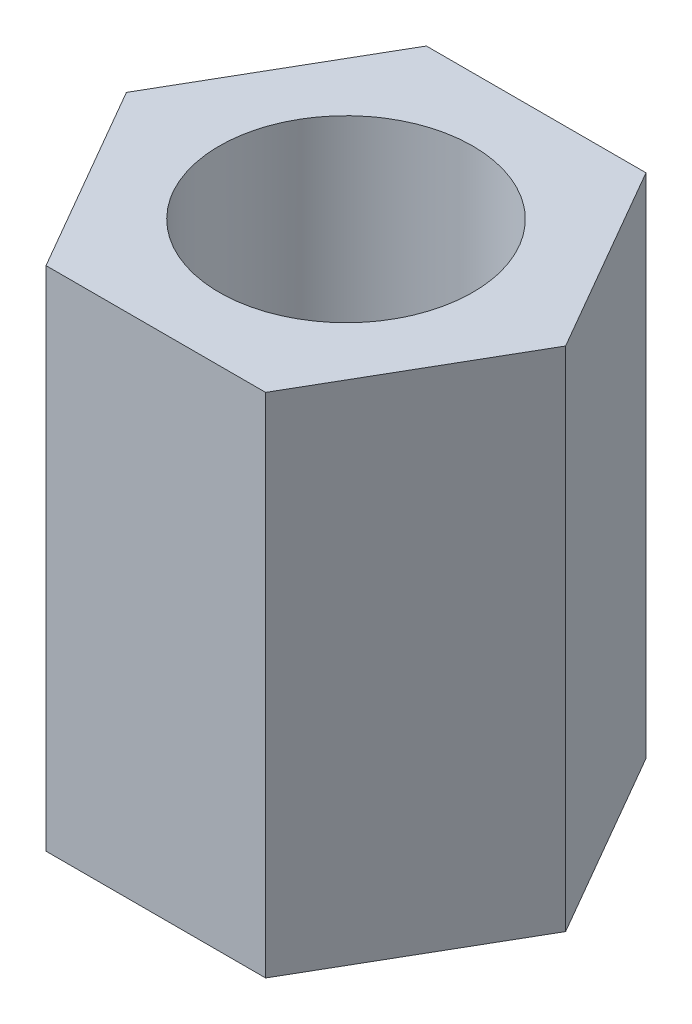
ISO-10303-21;
HEADER;
FILE_DESCRIPTION(('STEP AP214'),'2;1');
FILE_NAME('part.step','',(''),(''),'','','');
FILE_SCHEMA(('AUTOMOTIVE_DESIGN { 1 0 10303 214 1 1 1 1 }'));
ENDSEC;
DATA;
#1=APPLICATION_CONTEXT('core data for automotive mechanical design processes');
#2=APPLICATION_PROTOCOL_DEFINITION('international standard','automotive_design',2000,#1);
#3=PRODUCT_CONTEXT('',#1,'mechanical');
#4=PRODUCT('Part','Part','',(#3));
#5=PRODUCT_RELATED_PRODUCT_CATEGORY('part','',(#4));
#6=PRODUCT_DEFINITION_FORMATION('','',#4);
#7=PRODUCT_DEFINITION_CONTEXT('part definition',#1,'design');
#8=PRODUCT_DEFINITION('design','',#6,#7);
#9=PRODUCT_DEFINITION_SHAPE('','',#8);
#10=(LENGTH_UNIT() NAMED_UNIT(*) SI_UNIT(.MILLI.,.METRE.));
#11=(NAMED_UNIT(*) PLANE_ANGLE_UNIT() SI_UNIT($,.RADIAN.));
#12=(NAMED_UNIT(*) SI_UNIT($,.STERADIAN.) SOLID_ANGLE_UNIT());
#13=UNCERTAINTY_MEASURE_WITH_UNIT(LENGTH_MEASURE(1.E-05),#10,'distance_accuracy_value','');
#14=(GEOMETRIC_REPRESENTATION_CONTEXT(3) GLOBAL_UNCERTAINTY_ASSIGNED_CONTEXT((#13)) GLOBAL_UNIT_ASSIGNED_CONTEXT((#10,
#11,#12)) REPRESENTATION_CONTEXT('',''));
#15=CARTESIAN_POINT('',(0.,0.,0.));
#16=DIRECTION('',(0.,0.,1.));
#17=DIRECTION('',(1.,0.,0.));
#18=AXIS2_PLACEMENT_3D('',#15,#16,#17);
#19=CARTESIAN_POINT('',(1.732050808,0.,-3.));
#20=DIRECTION('',(-0.866025403855548,0.,0.499999999876834));
#21=DIRECTION('',(0.499999999876834,0.,0.866025403855548));
#22=AXIS2_PLACEMENT_3D('',#19,#20,#21);
#23=PLANE('',#22);
#24=DIRECTION('',(0.,1.,0.));
#25=VECTOR('',#24,1.);
#26=CARTESIAN_POINT('',(1.732050808,0.,-3.));
#27=LINE('',#26,#25);
#28=CARTESIAN_POINT('',(1.732050808,0.,-3.));
#29=VERTEX_POINT('',#28);
#30=CARTESIAN_POINT('',(1.732050808,8.,-3.));
#31=VERTEX_POINT('',#30);
#32=EDGE_CURVE('E22',#29,#31,#27,.T.);
#33=ORIENTED_EDGE('',*,*,#32,.T.);
#34=DIRECTION('',(-0.499999999876834,0.,-0.866025403855548));
#35=VECTOR('',#34,1.);
#36=CARTESIAN_POINT('',(3.46410161472361,8.,-4.78716025154036E-10));
#37=LINE('',#36,#35);
#38=CARTESIAN_POINT('',(3.464101615,8.,0.));
#39=VERTEX_POINT('',#38);
#40=EDGE_CURVE('E88',#39,#31,#37,.T.);
#41=ORIENTED_EDGE('',*,*,#40,.F.);
#42=DIRECTION('',(0.,1.,0.));
#43=VECTOR('',#42,1.);
#44=CARTESIAN_POINT('',(3.464101615,0.,0.));
#45=LINE('',#44,#43);
#46=CARTESIAN_POINT('',(3.464101615,0.,0.));
#47=VERTEX_POINT('',#46);
#48=EDGE_CURVE('E86',#39,#47,#45,.F.);
#49=ORIENTED_EDGE('',*,*,#48,.T.);
#50=DIRECTION('',(0.499999999876834,0.,0.866025403855548));
#51=VECTOR('',#50,1.);
#52=CARTESIAN_POINT('',(1.732050808,0.,-3.));
#53=LINE('',#52,#51);
#54=EDGE_CURVE('E73',#47,#29,#53,.F.);
#55=ORIENTED_EDGE('',*,*,#54,.T.);
#56=EDGE_LOOP('',(#33,#41,#49,#55));
#57=FACE_BOUND('',#56,.T.);
#58=ADVANCED_FACE('F17',(#57),#23,.F.);
#59=CARTESIAN_POINT('',(-1.732050808,0.,-3.));
#60=DIRECTION('',(0.,0.,1.));
#61=DIRECTION('',(1.,0.,0.));
#62=AXIS2_PLACEMENT_3D('',#59,#60,#61);
#63=PLANE('',#62);
#64=DIRECTION('',(0.,1.,0.));
#65=VECTOR('',#64,1.);
#66=CARTESIAN_POINT('',(-1.732050808,0.,-3.));
#67=LINE('',#66,#65);
#68=CARTESIAN_POINT('',(-1.732050808,0.,-3.));
#69=VERTEX_POINT('',#68);
#70=CARTESIAN_POINT('',(-1.732050808,8.,-3.));
#71=VERTEX_POINT('',#70);
#72=EDGE_CURVE('E145',#69,#71,#67,.T.);
#73=ORIENTED_EDGE('',*,*,#72,.T.);
#74=DIRECTION('',(1.,0.,0.));
#75=VECTOR('',#74,1.);
#76=CARTESIAN_POINT('',(-3.505670835,8.,-3.));
#77=LINE('',#76,#75);
#78=EDGE_CURVE('E129',#31,#71,#77,.F.);
#79=ORIENTED_EDGE('',*,*,#78,.F.);
#80=ORIENTED_EDGE('',*,*,#32,.F.);
#81=DIRECTION('',(1.,0.,0.));
#82=VECTOR('',#81,1.);
#83=CARTESIAN_POINT('',(-1.732050808,0.,-3.));
#84=LINE('',#83,#82);
#85=EDGE_CURVE('E79',#29,#69,#84,.F.);
#86=ORIENTED_EDGE('',*,*,#85,.T.);
#87=EDGE_LOOP('',(#73,#79,#80,#86));
#88=FACE_BOUND('',#87,.T.);
#89=ADVANCED_FACE('F155',(#88),#63,.F.);
#90=CARTESIAN_POINT('',(-3.464101615,0.,0.));
#91=DIRECTION('',(0.866025403855548,0.,0.499999999876834));
#92=DIRECTION('',(0.499999999876834,0.,-0.866025403855548));
#93=AXIS2_PLACEMENT_3D('',#90,#91,#92);
#94=PLANE('',#93);
#95=DIRECTION('',(0.,1.,0.));
#96=VECTOR('',#95,1.);
#97=CARTESIAN_POINT('',(-3.464101615,0.,0.));
#98=LINE('',#97,#96);
#99=CARTESIAN_POINT('',(-3.464101615,0.,0.));
#100=VERTEX_POINT('',#99);
#101=CARTESIAN_POINT('',(-3.464101615,8.,0.));
#102=VERTEX_POINT('',#101);
#103=EDGE_CURVE('E142',#100,#102,#98,.T.);
#104=ORIENTED_EDGE('',*,*,#103,.T.);
#105=DIRECTION('',(-0.499999999876834,0.,0.866025403855548));
#106=VECTOR('',#105,1.);
#107=CARTESIAN_POINT('',(-1.73205080773681,8.,-3.00000000045586));
#108=LINE('',#107,#106);
#109=EDGE_CURVE('E126',#71,#102,#108,.T.);
#110=ORIENTED_EDGE('',*,*,#109,.F.);
#111=ORIENTED_EDGE('',*,*,#72,.F.);
#112=DIRECTION('',(0.499999999876834,0.,-0.866025403855548));
#113=VECTOR('',#112,1.);
#114=CARTESIAN_POINT('',(-3.464101615,0.,0.));
#115=LINE('',#114,#113);
#116=EDGE_CURVE('E114',#69,#100,#115,.F.);
#117=ORIENTED_EDGE('',*,*,#116,.T.);
#118=EDGE_LOOP('',(#104,#110,#111,#117));
#119=FACE_BOUND('',#118,.T.);
#120=ADVANCED_FACE('F166',(#119),#94,.F.);
#121=CARTESIAN_POINT('',(-1.732050808,0.,3.));
#122=DIRECTION('',(0.866025403855548,0.,-0.499999999876834));
#123=DIRECTION('',(-0.499999999876834,0.,-0.866025403855548));
#124=AXIS2_PLACEMENT_3D('',#121,#122,#123);
#125=PLANE('',#124);
#126=DIRECTION('',(0.,1.,0.));
#127=VECTOR('',#126,1.);
#128=CARTESIAN_POINT('',(-1.732050808,0.,3.));
#129=LINE('',#128,#127);
#130=CARTESIAN_POINT('',(-1.732050808,0.,3.));
#131=VERTEX_POINT('',#130);
#132=CARTESIAN_POINT('',(-1.732050808,8.,3.));
#133=VERTEX_POINT('',#132);
#134=EDGE_CURVE('E138',#131,#133,#129,.T.);
#135=ORIENTED_EDGE('',*,*,#134,.T.);
#136=DIRECTION('',(0.499999999876834,0.,0.866025403855548));
#137=VECTOR('',#136,1.);
#138=CARTESIAN_POINT('',(-3.46410161472361,8.,4.78716025154036E-10));
#139=LINE('',#138,#137);
#140=EDGE_CURVE('E123',#102,#133,#139,.T.);
#141=ORIENTED_EDGE('',*,*,#140,.F.);
#142=ORIENTED_EDGE('',*,*,#103,.F.);
#143=DIRECTION('',(-0.499999999876834,0.,-0.866025403855548));
#144=VECTOR('',#143,1.);
#145=CARTESIAN_POINT('',(-1.732050808,0.,3.));
#146=LINE('',#145,#144);
#147=EDGE_CURVE('E104',#100,#131,#146,.F.);
#148=ORIENTED_EDGE('',*,*,#147,.T.);
#149=EDGE_LOOP('',(#135,#141,#142,#148));
#150=FACE_BOUND('',#149,.T.);
#151=ADVANCED_FACE('F164',(#150),#125,.F.);
#152=CARTESIAN_POINT('',(1.732050808,0.,3.));
#153=DIRECTION('',(0.,0.,-1.));
#154=DIRECTION('',(-1.,0.,0.));
#155=AXIS2_PLACEMENT_3D('',#152,#153,#154);
#156=PLANE('',#155);
#157=DIRECTION('',(0.,1.,0.));
#158=VECTOR('',#157,1.);
#159=CARTESIAN_POINT('',(1.732050808,0.,3.));
#160=LINE('',#159,#158);
#161=CARTESIAN_POINT('',(1.732050808,0.,3.));
#162=VERTEX_POINT('',#161);
#163=CARTESIAN_POINT('',(1.732050808,8.,3.));
#164=VERTEX_POINT('',#163);
#165=EDGE_CURVE('E38',#162,#164,#160,.T.);
#166=ORIENTED_EDGE('',*,*,#165,.T.);
#167=DIRECTION('',(1.,0.,0.));
#168=VECTOR('',#167,1.);
#169=CARTESIAN_POINT('',(-3.505670835,8.,3.));
#170=LINE('',#169,#168);
#171=EDGE_CURVE('E82',#133,#164,#170,.T.);
#172=ORIENTED_EDGE('',*,*,#171,.F.);
#173=ORIENTED_EDGE('',*,*,#134,.F.);
#174=DIRECTION('',(-1.,0.,0.));
#175=VECTOR('',#174,1.);
#176=CARTESIAN_POINT('',(1.732050808,0.,3.));
#177=LINE('',#176,#175);
#178=EDGE_CURVE('E95',#131,#162,#177,.F.);
#179=ORIENTED_EDGE('',*,*,#178,.T.);
#180=EDGE_LOOP('',(#166,#172,#173,#179));
#181=FACE_BOUND('',#180,.T.);
#182=ADVANCED_FACE('F161',(#181),#156,.F.);
#183=CARTESIAN_POINT('',(3.464101615,0.,0.));
#184=DIRECTION('',(-0.866025403855548,0.,-0.499999999876834));
#185=DIRECTION('',(-0.499999999876834,0.,0.866025403855548));
#186=AXIS2_PLACEMENT_3D('',#183,#184,#185);
#187=PLANE('',#186);
#188=ORIENTED_EDGE('',*,*,#48,.F.);
#189=DIRECTION('',(0.499999999876834,0.,-0.866025403855548));
#190=VECTOR('',#189,1.);
#191=CARTESIAN_POINT('',(1.73205080773681,8.,3.00000000045586));
#192=LINE('',#191,#190);
#193=EDGE_CURVE('E91',#164,#39,#192,.T.);
#194=ORIENTED_EDGE('',*,*,#193,.F.);
#195=ORIENTED_EDGE('',*,*,#165,.F.);
#196=DIRECTION('',(-0.499999999876834,0.,0.866025403855548));
#197=VECTOR('',#196,1.);
#198=CARTESIAN_POINT('',(3.464101615,0.,0.));
#199=LINE('',#198,#197);
#200=EDGE_CURVE('E76',#162,#47,#199,.F.);
#201=ORIENTED_EDGE('',*,*,#200,.T.);
#202=EDGE_LOOP('',(#188,#194,#195,#201));
#203=FACE_BOUND('',#202,.T.);
#204=ADVANCED_FACE('F93',(#203),#187,.F.);
#205=CARTESIAN_POINT('',(-3.505670835,8.,-3.));
#206=DIRECTION('',(0.,1.,0.));
#207=DIRECTION('',(0.,0.,1.));
#208=AXIS2_PLACEMENT_3D('',#205,#206,#207);
#209=PLANE('',#208);
#210=CARTESIAN_POINT('',(-1.19723388120618E-10,8.,-2.));
#211=CARTESIAN_POINT('',(-0.0561537282825787,8.,-1.99999966326123));
#212=CARTESIAN_POINT('',(-0.112317776617583,8.,-1.99763295356125));
#213=CARTESIAN_POINT('',(-0.224257742730536,8.,-1.98818150785587));
#214=CARTESIAN_POINT('',(-0.280033541006416,8.,-1.98109537894131));
#215=CARTESIAN_POINT('',(-0.390883816128431,8.,-1.96223695577142));
#216=CARTESIAN_POINT('',(-0.445957035799322,8.,-1.950457222763));
#217=CARTESIAN_POINT('',(-0.554945941310325,8.,-1.92229286464738));
#218=CARTESIAN_POINT('',(-0.608860649426699,8.,-1.90590450264052));
#219=CARTESIAN_POINT('',(-0.768058884950165,8.,-1.85005263952839));
#220=CARTESIAN_POINT('',(-0.871064439413996,8.,-1.80385648741787));
#221=CARTESIAN_POINT('',(-1.06784493792675,8.,-1.69480474605575));
#222=CARTESIAN_POINT('',(-1.16161953089511,8.,-1.63194852350822));
#223=CARTESIAN_POINT('',(-1.29332617529571,8.,-1.5265915317294));
#224=CARTESIAN_POINT('',(-1.33576066157836,8.,-1.48959927251656));
#225=CARTESIAN_POINT('',(-1.41732574908343,8.,-1.41221312952993));
#226=CARTESIAN_POINT('',(-1.45645949630214,8.,-1.37182255982206));
#227=CARTESIAN_POINT('',(-1.56856725646422,8.,-1.24587628298798));
#228=CARTESIAN_POINT('',(-1.63627627659007,8.,-1.15552317333004));
#229=CARTESIAN_POINT('',(-1.75552410747972,8.,-0.964781086284522));
#230=CARTESIAN_POINT('',(-1.80706352797462,8.,-0.864392487508325));
#231=CARTESIAN_POINT('',(-1.89256650045295,8.,-0.656376282856753));
#232=CARTESIAN_POINT('',(-1.92653024015285,8.,-0.5487487543104));
#233=CARTESIAN_POINT('',(-1.97590388958835,8.,-0.329321779905196));
#234=CARTESIAN_POINT('',(-1.9913137002381,8.,-0.217522311769705));
#235=CARTESIAN_POINT('',(-2.00314655628282,8.,0.00707692912882603));
#236=CARTESIAN_POINT('',(-1.99956960167778,8.,0.119876701891865));
#237=CARTESIAN_POINT('',(-1.97352600062362,8.,0.343276982105055));
#238=CARTESIAN_POINT('',(-1.95105945505258,8.,0.453877501296883));
#239=CARTESIAN_POINT('',(-1.88788753049189,8.,0.669726540320858));
#240=CARTESIAN_POINT('',(-1.84718195669945,8.,0.774975002976744));
#241=CARTESIAN_POINT('',(-1.7486368702934,8.,0.977191359603996));
#242=CARTESIAN_POINT('',(-1.69079671154076,8.,1.07415894112863));
#243=CARTESIAN_POINT('',(-1.59254362203355,8.,1.21118793418928));
#244=CARTESIAN_POINT('',(-1.55787063408007,8.,1.2554669608168));
#245=CARTESIAN_POINT('',(-1.48488858435554,8.,1.34099531309872));
#246=CARTESIAN_POINT('',(-1.44657604577215,8.,1.38224167360529));
#247=CARTESIAN_POINT('',(-1.32666911005668,8.,1.50085475325198));
#248=CARTESIAN_POINT('',(-1.24001838562408,8.,1.57321655916251));
#249=CARTESIAN_POINT('',(-1.05578607169728,8.,1.7023416976686));
#250=CARTESIAN_POINT('',(-0.9582048978849,8.,1.75910562316373));
#251=CARTESIAN_POINT('',(-0.805756713294285,8.,1.83137636289948));
#252=CARTESIAN_POINT('',(-0.753862511343682,8.,1.8533391943305));
#253=CARTESIAN_POINT('',(-0.648436383581057,8.,1.89279986053878));
#254=CARTESIAN_POINT('',(-0.594905822742257,8.,1.91030130879231));
#255=CARTESIAN_POINT('',(-0.486650790341392,8.,1.94070314391751));
#256=CARTESIAN_POINT('',(-0.431928350636566,8.,1.95361079626189));
#257=CARTESIAN_POINT('',(-0.321601203035077,8.,1.97477223150026));
#258=CARTESIAN_POINT('',(-0.2659967603416,8.,1.98302738703549));
#259=CARTESIAN_POINT('',(-0.175255113092284,8.,1.99261587204262));
#260=CARTESIAN_POINT('',(-0.14026319213172,8.,1.99538404364552));
#261=CARTESIAN_POINT('',(-0.0701821911749014,8.,1.99907621284032));
#262=CARTESIAN_POINT('',(-0.035093111178646,8.,2.00000021043223));
#263=CARTESIAN_POINT('',(0.0561537276156468,8.,1.99999966327995));
#264=CARTESIAN_POINT('',(0.112317775951283,8.,1.99763295359871));
#265=CARTESIAN_POINT('',(0.224257742067113,8.,1.9881815079307));
#266=CARTESIAN_POINT('',(0.280033540345237,8.,1.98109537903477));
#267=CARTESIAN_POINT('',(0.390883815473596,8.,1.96223695590187));
#268=CARTESIAN_POINT('',(0.445957035148587,8.,1.95045722291179));
#269=CARTESIAN_POINT('',(0.554945940669289,8.,1.92229286483244));
#270=CARTESIAN_POINT('',(0.608860648791264,8.,1.90590450284352));
#271=CARTESIAN_POINT('',(0.768058884333474,8.,1.85005263978441));
#272=CARTESIAN_POINT('',(0.871064438812698,8.,1.80385648770824));
#273=CARTESIAN_POINT('',(1.0678449373618,8.,1.6948047464117));
#274=CARTESIAN_POINT('',(1.16161953035113,8.,1.63194852389543));
#275=CARTESIAN_POINT('',(1.29332617478684,8.,1.52659153216052));
#276=CARTESIAN_POINT('',(1.33576066108181,8.,1.48959927296182));
#277=CARTESIAN_POINT('',(1.41732574861266,8.,1.41221313000239));
#278=CARTESIAN_POINT('',(1.45645949584483,8.,1.37182256030757));
#279=CARTESIAN_POINT('',(1.5685672560489,8.,1.24587628351087));
#280=CARTESIAN_POINT('',(1.63627627620489,8.,1.15552317387548));
#281=CARTESIAN_POINT('',(1.75552410715813,8.,0.964781086869693));
#282=CARTESIAN_POINT('',(1.8070635276865,8.,0.864392488110672));
#283=CARTESIAN_POINT('',(1.89256650023416,8.,0.6563762834876));
#284=CARTESIAN_POINT('',(1.92653023996993,8.,0.548748754952572));
#285=CARTESIAN_POINT('',(1.97590388947858,8.,0.32932178056383));
#286=CARTESIAN_POINT('',(1.99131370016559,8.,0.217522312433476));
#287=CARTESIAN_POINT('',(2.00314655628517,8.,-0.00707692846111013));
#288=CARTESIAN_POINT('',(1.99956960171774,8.,-0.119876701225342));
#289=CARTESIAN_POINT('',(1.97352600073804,8.,-0.343276981447217));
#290=CARTESIAN_POINT('',(1.95105945520387,8.,-0.453877500646539));
#291=CARTESIAN_POINT('',(1.88788753071513,8.,-0.66972653969157));
#292=CARTESIAN_POINT('',(1.84718195695777,8.,-0.774975002361022));
#293=CARTESIAN_POINT('',(1.74863687061914,8.,-0.977191359021102));
#294=CARTESIAN_POINT('',(1.69079671189883,8.,-1.074158940565));
#295=CARTESIAN_POINT('',(1.5925436224373,8.,-1.21118793365839));
#296=CARTESIAN_POINT('',(1.55787063449858,8.,-1.25546696029749));
#297=CARTESIAN_POINT('',(1.48488858480255,8.,-1.34099531260374));
#298=CARTESIAN_POINT('',(1.4465760462329,8.,-1.38224167312309));
#299=CARTESIAN_POINT('',(1.32666911055697,8.,-1.50085475280975));
#300=CARTESIAN_POINT('',(1.24001838614849,8.,-1.57321655874916));
#301=CARTESIAN_POINT('',(1.05578607226473,8.,-1.70234169731666));
#302=CARTESIAN_POINT('',(0.958204898471274,8.,-1.75910562284432));
#303=CARTESIAN_POINT('',(0.805756713904871,8.,-1.83137636263083));
#304=CARTESIAN_POINT('',(0.753862511961722,8.,-1.8533391940791));
#305=CARTESIAN_POINT('',(0.648436384212554,8.,-1.89279986032244));
#306=CARTESIAN_POINT('',(0.594905823379758,8.,-1.91030130859377));
#307=CARTESIAN_POINT('',(0.486650790989089,8.,-1.9407031437551));
#308=CARTESIAN_POINT('',(0.431928351288452,8.,-1.95361079611776));
#309=CARTESIAN_POINT('',(0.321601203693751,8.,-1.974772231393));
#310=CARTESIAN_POINT('',(0.265996761002872,8.,-1.9830273869468));
#311=CARTESIAN_POINT('',(0.175255113535491,8.,-1.99261587200755));
#312=CARTESIAN_POINT('',(0.140263192353632,8.,-1.99538404363383));
#313=CARTESIAN_POINT('',(0.0701821909529896,8.,-1.99907621285201));
#314=CARTESIAN_POINT('',(0.0350931107342072,8.,-2.00000021044392));
#315=CARTESIAN_POINT('',(-1.19723388120618E-10,8.,-2.));
#316=B_SPLINE_CURVE_WITH_KNOTS('',3,(#210,#211,#212,#213,#214,#215,#216,#217,#218,#219,#220,
#221,#222,#223,#224,#225,#226,#227,#228,#229,#230,#231,#232,#233,#234,#235,#236,#237,#238,#239,
#240,#241,#242,#243,#244,#245,#246,#247,#248,#249,#250,#251,#252,#253,#254,#255,#256,#257,#258,
#259,#260,#261,#262,#263,#264,#265,#266,#267,#268,#269,#270,#271,#272,#273,#274,#275,#276,#277,
#278,#279,#280,#281,#282,#283,#284,#285,#286,#287,#288,#289,#290,#291,#292,#293,#294,#295,#296,
#297,#298,#299,#300,#301,#302,#303,#304,#305,#306,#307,#308,#309,#310,#311,#312,#313,#314,#315),
.UNSPECIFIED.,.T.,.F.,(4,2,2,2,2,2,2,2,2,2,2,2,2,2,2,2,2,2,2,2,2,2,2,2,2,2,2,2,2,2,2,2,2,2,2,2,
2,2,2,2,2,2,2,2,2,2,2,2,2,2,2,2,4),(0.,0.168428877456362,0.33690748775991,0.505654183695087,
0.674538104121825,1.01150089527945,1.34847649717352,1.51718508008366,1.68573100250976,
2.02271470724979,2.35968570331694,2.69665310030229,3.03362229682857,3.37059149335485,
3.70755889034019,4.04452988640734,4.38151359114743,4.5500595135735,4.71876809648362,
5.05574369837771,5.39270648953531,5.56159040996248,5.73033710589816,5.89881571620138,
6.06724459365714,6.17250373536567,6.2777628770742,6.44619175452996,6.61467036483318,
6.78341706076886,6.95230098119603,7.28926377235363,7.62623937424772,7.79494795715784,
7.96349387958391,8.300477584324,8.63744858039115,8.97441597737649,9.31138517390277,
9.64835437042905,9.9853217674144,10.3222927634815,10.6592764682216,10.8278223906477,
10.9965309735578,11.3335065754519,11.6704693666095,11.8393532870363,12.0080999829714,
12.176578593275,12.3450074707313,12.4502666131063,12.5555257554813),.UNSPECIFIED.);
#317=CARTESIAN_POINT('',(-1.19723388120618E-10,8.,-2.));
#318=VERTEX_POINT('',#317);
#319=EDGE_CURVE('E29',#318,#318,#316,.T.);
#320=ORIENTED_EDGE('',*,*,#319,.F.);
#321=EDGE_LOOP('',(#320));
#322=FACE_BOUND('',#321,.T.);
#323=ORIENTED_EDGE('',*,*,#140,.T.);
#324=ORIENTED_EDGE('',*,*,#171,.T.);
#325=ORIENTED_EDGE('',*,*,#193,.T.);
#326=ORIENTED_EDGE('',*,*,#40,.T.);
#327=ORIENTED_EDGE('',*,*,#78,.T.);
#328=ORIENTED_EDGE('',*,*,#109,.T.);
#329=EDGE_LOOP('',(#323,#324,#325,#326,#327,#328));
#330=FACE_BOUND('',#329,.T.);
#331=ADVANCED_FACE('F157',(#322,#330),#209,.T.);
#332=CARTESIAN_POINT('',(-3.505670835,0.,-3.));
#333=DIRECTION('',(0.,1.,0.));
#334=DIRECTION('',(0.,0.,1.));
#335=AXIS2_PLACEMENT_3D('',#332,#333,#334);
#336=PLANE('',#335);
#337=CARTESIAN_POINT('',(-5.46942690457236E-10,0.,2.));
#338=CARTESIAN_POINT('',(-0.0561537287097979,0.,1.99999966324924));
#339=CARTESIAN_POINT('',(-0.112317777044296,0.,1.99763295353726));
#340=CARTESIAN_POINT('',(-0.224257743155231,0.,1.98818150780797));
#341=CARTESIAN_POINT('',(-0.280033541429597,0.,1.9810953788815));
#342=CARTESIAN_POINT('',(-0.390883816547583,0.,1.96223695568792));
#343=CARTESIAN_POINT('',(-0.445957036215958,0.,1.95045722266774));
#344=CARTESIAN_POINT('',(-0.554945941720945,0.,1.92229286452883));
#345=CARTESIAN_POINT('',(-0.608860649833819,0.,1.90590450251046));
#346=CARTESIAN_POINT('',(-0.768058885345354,0.,1.85005263936433));
#347=CARTESIAN_POINT('',(-0.871064439799317,0.,1.80385648723181));
#348=CARTESIAN_POINT('',(-1.06784493828878,0.,1.69480474582764));
#349=CARTESIAN_POINT('',(-1.16161953124371,0.,1.63194852326009));
#350=CARTESIAN_POINT('',(-1.2933261756218,0.,1.52659153145313));
#351=CARTESIAN_POINT('',(-1.33576066189655,0.,1.48959927223123));
#352=CARTESIAN_POINT('',(-1.41732574938509,0.,1.41221312922717));
#353=CARTESIAN_POINT('',(-1.45645949659517,0.,1.37182255951094));
#354=CARTESIAN_POINT('',(-1.56856725673035,0.,1.24587628265292));
#355=CARTESIAN_POINT('',(-1.6362762768369,0.,1.15552317298052));
#356=CARTESIAN_POINT('',(-1.7555241076858,0.,0.964781085909526));
#357=CARTESIAN_POINT('',(-1.80706352815926,0.,0.86439248712232));
#358=CARTESIAN_POINT('',(-1.89256650059316,0.,0.656376282452483));
#359=CARTESIAN_POINT('',(-1.92653024027007,0.,0.548748753898875));
#360=CARTESIAN_POINT('',(-1.9759038896587,0.,0.329321779483125));
#361=CARTESIAN_POINT('',(-1.99131370028457,0.,0.217522311344341));
#362=CARTESIAN_POINT('',(-2.0031465562813,0.,-0.00707692955671774));
#363=CARTESIAN_POINT('',(-1.99956960165217,0.,-0.119876702318993));
#364=CARTESIAN_POINT('',(-1.97352600055029,0.,-0.34327698252662));
#365=CARTESIAN_POINT('',(-1.95105945495563,0.,-0.453877501713649));
#366=CARTESIAN_POINT('',(-1.88788753034883,0.,-0.66972654072413));
#367=CARTESIAN_POINT('',(-1.8471819565339,0.,-0.774975003371321));
#368=CARTESIAN_POINT('',(-1.74863687008466,0.,-0.977191359977522));
#369=CARTESIAN_POINT('',(-1.69079671131131,0.,-1.0741589414898));
#370=CARTESIAN_POINT('',(-1.59254362177482,0.,-1.21118793452946));
#371=CARTESIAN_POINT('',(-1.55787063381189,0.,-1.25546696114958));
#372=CARTESIAN_POINT('',(-1.48488858406909,0.,-1.3409953134159));
#373=CARTESIAN_POINT('',(-1.44657604547689,0.,-1.38224167391429));
#374=CARTESIAN_POINT('',(-1.32666910973608,0.,-1.50085475353537));
#375=CARTESIAN_POINT('',(-1.24001838528802,0.,-1.57321655942739));
#376=CARTESIAN_POINT('',(-1.05578607133364,0.,-1.70234169789413));
#377=CARTESIAN_POINT('',(-0.958204897509137,0.,-1.75910562336841));
#378=CARTESIAN_POINT('',(-0.805756712903085,0.,-1.8313763630716));
#379=CARTESIAN_POINT('',(-0.75386251094779,0.,-1.85333919449153));
#380=CARTESIAN_POINT('',(-0.648436383176736,0.,-1.89279986067729));
#381=CARTESIAN_POINT('',(-0.594905822334197,0.,-1.91030130891938));
#382=CARTESIAN_POINT('',(-0.486650789926838,0.,-1.94070314402146));
#383=CARTESIAN_POINT('',(-0.431928350219255,0.,-1.95361079635415));
#384=CARTESIAN_POINT('',(-0.321601202613246,0.,-1.97477223156896));
#385=CARTESIAN_POINT('',(-0.265996759918006,0.,-1.98302738709231));
#386=CARTESIAN_POINT('',(-0.175255112666642,0.,-1.99261587208005));
#387=CARTESIAN_POINT('',(-0.140263191705487,0.,-1.99538404367548));
#388=CARTESIAN_POINT('',(-0.0701821907478794,0.,-1.99907621285531));
#389=CARTESIAN_POINT('',(-0.0350931107514267,0.,-2.00000021043972));
#390=CARTESIAN_POINT('',(0.056153728042866,0.,-1.99999966326795));
#391=CARTESIAN_POINT('',(0.112317776377997,0.,-1.99763295357471));
#392=CARTESIAN_POINT('',(0.224257742491808,0.,-1.9881815078828));
#393=CARTESIAN_POINT('',(0.280033540768418,0.,-1.98109537897495));
#394=CARTESIAN_POINT('',(0.39088381589275,0.,-1.96223695581837));
#395=CARTESIAN_POINT('',(0.445957035565224,0.,-1.95045722281653));
#396=CARTESIAN_POINT('',(0.55494594107991,0.,-1.9222928647139));
#397=CARTESIAN_POINT('',(0.608860649198384,0.,-1.90590450271346));
#398=CARTESIAN_POINT('',(0.768058884728664,0.,-1.85005263962035));
#399=CARTESIAN_POINT('',(0.87106443919802,0.,-1.80385648752217));
#400=CARTESIAN_POINT('',(1.06784493772383,0.,-1.6948047461836));
#401=CARTESIAN_POINT('',(1.16161953069973,0.,-1.63194852364729));
#402=CARTESIAN_POINT('',(1.29332617511293,0.,-1.52659153188425));
#403=CARTESIAN_POINT('',(1.33576066140001,0.,-1.48959927267649));
#404=CARTESIAN_POINT('',(1.41732574891433,0.,-1.41221312969964));
#405=CARTESIAN_POINT('',(1.45645949613787,0.,-1.37182255999646));
#406=CARTESIAN_POINT('',(1.56856725631504,0.,-1.24587628317581));
#407=CARTESIAN_POINT('',(1.63627627645172,0.,-1.15552317352596));
#408=CARTESIAN_POINT('',(1.75552410736421,0.,-0.964781086494696));
#409=CARTESIAN_POINT('',(1.80706352787114,0.,-0.864392487724665));
#410=CARTESIAN_POINT('',(1.89256650037437,0.,-0.656376283083329));
#411=CARTESIAN_POINT('',(1.92653024008715,0.,-0.548748754541046));
#412=CARTESIAN_POINT('',(1.97590388954892,0.,-0.329321780141758));
#413=CARTESIAN_POINT('',(1.99131370021206,0.,-0.217522312008112));
#414=CARTESIAN_POINT('',(2.00314655628366,0.,0.00707692888900242));
#415=CARTESIAN_POINT('',(1.99956960169213,0.,0.119876701652471));
#416=CARTESIAN_POINT('',(1.97352600066472,0.,0.343276981868783));
#417=CARTESIAN_POINT('',(1.95105945510692,0.,0.453877501063305));
#418=CARTESIAN_POINT('',(1.88788753057207,0.,0.669726540094842));
#419=CARTESIAN_POINT('',(1.84718195679223,0.,0.774975002755599));
#420=CARTESIAN_POINT('',(1.7486368704104,0.,0.977191359394629));
#421=CARTESIAN_POINT('',(1.69079671166938,0.,1.07415894092618));
#422=CARTESIAN_POINT('',(1.59254362217858,0.,1.21118793399858));
#423=CARTESIAN_POINT('',(1.5578706342304,0.,1.25546696063026));
#424=CARTESIAN_POINT('',(1.4848885845161,0.,1.34099531292093));
#425=CARTESIAN_POINT('',(1.44657604593764,0.,1.38224167343209));
#426=CARTESIAN_POINT('',(1.32666911023637,0.,1.50085475309314));
#427=CARTESIAN_POINT('',(1.24001838581244,0.,1.57321655901404));
#428=CARTESIAN_POINT('',(1.0557860719011,0.,1.70234169754219));
#429=CARTESIAN_POINT('',(0.958204898095512,0.,1.75910562304901));
#430=CARTESIAN_POINT('',(0.805756713513671,0.,1.83137636280295));
#431=CARTESIAN_POINT('',(0.753862511565831,0.,1.85333919424014));
#432=CARTESIAN_POINT('',(0.648436383808233,0.,1.89279986046095));
#433=CARTESIAN_POINT('',(0.594905822971699,0.,1.91030130872085));
#434=CARTESIAN_POINT('',(0.486650790574537,0.,1.94070314385905));
#435=CARTESIAN_POINT('',(0.431928350871142,0.,1.95361079621003));
#436=CARTESIAN_POINT('',(0.321601203271921,0.,1.9747722314617));
#437=CARTESIAN_POINT('',(0.265996760579279,0.,1.98302738700362));
#438=CARTESIAN_POINT('',(0.175255113109849,0.,1.99261587204499));
#439=CARTESIAN_POINT('',(0.140263191927399,0.,1.99538404366379));
#440=CARTESIAN_POINT('',(0.0701821905259677,0.,1.99907621286701));
#441=CARTESIAN_POINT('',(0.0350931103069878,0.,2.00000021045142));
#442=CARTESIAN_POINT('',(-5.46942690457236E-10,0.,2.));
#443=B_SPLINE_CURVE_WITH_KNOTS('',3,(#337,#338,#339,#340,#341,#342,#343,#344,#345,#346,#347,
#348,#349,#350,#351,#352,#353,#354,#355,#356,#357,#358,#359,#360,#361,#362,#363,#364,#365,#366,
#367,#368,#369,#370,#371,#372,#373,#374,#375,#376,#377,#378,#379,#380,#381,#382,#383,#384,#385,
#386,#387,#388,#389,#390,#391,#392,#393,#394,#395,#396,#397,#398,#399,#400,#401,#402,#403,#404,
#405,#406,#407,#408,#409,#410,#411,#412,#413,#414,#415,#416,#417,#418,#419,#420,#421,#422,#423,
#424,#425,#426,#427,#428,#429,#430,#431,#432,#433,#434,#435,#436,#437,#438,#439,#440,#441,#442),
.UNSPECIFIED.,.T.,.F.,(4,2,2,2,2,2,2,2,2,2,2,2,2,2,2,2,2,2,2,2,2,2,2,2,2,2,2,2,2,2,2,2,2,2,2,2,
2,2,2,2,2,2,2,2,2,2,2,2,2,2,2,2,4),(0.,0.168428877456362,0.33690748775991,0.505654183695087,
0.674538104121825,1.01150089527945,1.34847649717352,1.51718508008366,1.68573100250976,
2.02271470724979,2.35968570331694,2.69665310030229,3.03362229682857,3.37059149335485,
3.70755889034019,4.04452988640734,4.38151359114743,4.5500595135735,4.71876809648362,
5.05574369837771,5.39270648953531,5.56159040996248,5.73033710589816,5.89881571620138,
6.06724459365714,6.17250373536567,6.2777628770742,6.44619175452996,6.61467036483318,
6.78341706076886,6.95230098119603,7.28926377235363,7.62623937424772,7.79494795715784,
7.96349387958391,8.300477584324,8.63744858039115,8.97441597737649,9.31138517390277,
9.64835437042905,9.9853217674144,10.3222927634815,10.6592764682216,10.8278223906477,
10.9965309735578,11.3335065754519,11.6704693666095,11.8393532870363,12.0080999829714,
12.176578593275,12.3450074707313,12.4502666131063,12.5555257554813),.UNSPECIFIED.);
#444=CARTESIAN_POINT('',(-5.46942690457236E-10,0.,2.));
#445=VERTEX_POINT('',#444);
#446=EDGE_CURVE('E11',#445,#445,#443,.T.);
#447=ORIENTED_EDGE('',*,*,#446,.F.);
#448=EDGE_LOOP('',(#447));
#449=FACE_BOUND('',#448,.T.);
#450=ORIENTED_EDGE('',*,*,#178,.F.);
#451=ORIENTED_EDGE('',*,*,#147,.F.);
#452=ORIENTED_EDGE('',*,*,#116,.F.);
#453=ORIENTED_EDGE('',*,*,#85,.F.);
#454=ORIENTED_EDGE('',*,*,#54,.F.);
#455=ORIENTED_EDGE('',*,*,#200,.F.);
#456=EDGE_LOOP('',(#450,#451,#452,#453,#454,#455));
#457=FACE_BOUND('',#456,.T.);
#458=ADVANCED_FACE('F19',(#449,#457),#336,.F.);
#459=CARTESIAN_POINT('',(0.,8.,-2.));
#460=CARTESIAN_POINT('',(0.,0.,-2.));
#461=(BOUNDED_CURVE() B_SPLINE_CURVE(1,(#459,#460),.UNSPECIFIED.,.F.,
.F.) B_SPLINE_CURVE_WITH_KNOTS((2,2),(0.,1.),
.UNSPECIFIED.) CURVE() GEOMETRIC_REPRESENTATION_ITEM() RATIONAL_B_SPLINE_CURVE((1.,1.)) REPRESENTATION_ITEM(''));
#462=CARTESIAN_POINT('',(0.,8.,0.));
#463=DIRECTION('',(0.,-1.,0.));
#464=AXIS1_PLACEMENT('',#462,#463);
#465=SURFACE_OF_REVOLUTION('',#461,#464);
#466=ORIENTED_EDGE('',*,*,#446,.T.);
#467=EDGE_LOOP('',(#466));
#468=FACE_BOUND('',#467,.T.);
#469=ORIENTED_EDGE('',*,*,#319,.T.);
#470=EDGE_LOOP('',(#469));
#471=FACE_BOUND('',#470,.T.);
#472=ADVANCED_FACE('F176',(#468,#471),#465,.F.);
#473=CLOSED_SHELL('',(#58,#89,#120,#151,#182,#204,#331,#458,#472));
#474=MANIFOLD_SOLID_BREP('B1',#473);
#475=ADVANCED_BREP_SHAPE_REPRESENTATION('',(#18,#474),#14);
#476=SHAPE_DEFINITION_REPRESENTATION(#9,#475);
ENDSEC;
END-ISO-10303-21;
